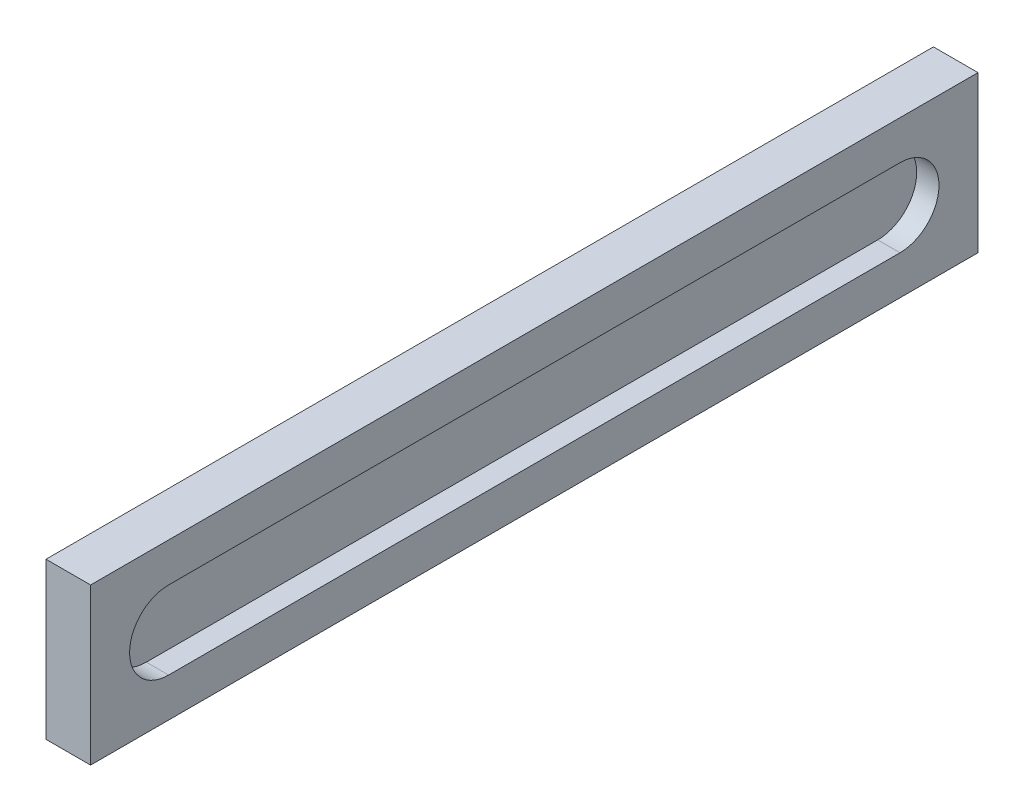
ISO-10303-21;
HEADER;
FILE_DESCRIPTION(('STEP AP214'),'2;1');
FILE_NAME('part.step','',(''),(''),'','','');
FILE_SCHEMA(('AUTOMOTIVE_DESIGN { 1 0 10303 214 1 1 1 1 }'));
ENDSEC;
DATA;
#1=APPLICATION_CONTEXT('core data for automotive mechanical design processes');
#2=APPLICATION_PROTOCOL_DEFINITION('international standard','automotive_design',2000,#1);
#3=PRODUCT_CONTEXT('',#1,'mechanical');
#4=PRODUCT('Part','Part','',(#3));
#5=PRODUCT_RELATED_PRODUCT_CATEGORY('part','',(#4));
#6=PRODUCT_DEFINITION_FORMATION('','',#4);
#7=PRODUCT_DEFINITION_CONTEXT('part definition',#1,'design');
#8=PRODUCT_DEFINITION('design','',#6,#7);
#9=PRODUCT_DEFINITION_SHAPE('','',#8);
#10=(LENGTH_UNIT() NAMED_UNIT(*) SI_UNIT(.MILLI.,.METRE.));
#11=(NAMED_UNIT(*) PLANE_ANGLE_UNIT() SI_UNIT($,.RADIAN.));
#12=(NAMED_UNIT(*) SI_UNIT($,.STERADIAN.) SOLID_ANGLE_UNIT());
#13=UNCERTAINTY_MEASURE_WITH_UNIT(LENGTH_MEASURE(1.E-05),#10,'distance_accuracy_value','');
#14=(GEOMETRIC_REPRESENTATION_CONTEXT(3) GLOBAL_UNCERTAINTY_ASSIGNED_CONTEXT((#13)) GLOBAL_UNIT_ASSIGNED_CONTEXT((#10,
#11,#12)) REPRESENTATION_CONTEXT('',''));
#15=CARTESIAN_POINT('',(0.,0.,0.));
#16=DIRECTION('',(0.,0.,1.));
#17=DIRECTION('',(1.,0.,0.));
#18=AXIS2_PLACEMENT_3D('',#15,#16,#17);
#19=CARTESIAN_POINT('',(20.,0.,0.));
#20=DIRECTION('',(0.,0.,-1.));
#21=DIRECTION('',(-1.,0.,0.));
#22=AXIS2_PLACEMENT_3D('',#19,#20,#21);
#23=PLANE('',#22);
#24=DIRECTION('',(0.,-1.,0.));
#25=VECTOR('',#24,1.);
#26=CARTESIAN_POINT('',(0.,0.,0.));
#27=LINE('',#26,#25);
#28=CARTESIAN_POINT('',(0.,70.,0.));
#29=VERTEX_POINT('',#28);
#30=CARTESIAN_POINT('',(0.,0.,0.));
#31=VERTEX_POINT('',#30);
#32=EDGE_CURVE('E142',#29,#31,#27,.T.);
#33=ORIENTED_EDGE('',*,*,#32,.T.);
#34=DIRECTION('',(-1.,0.,0.));
#35=VECTOR('',#34,1.);
#36=CARTESIAN_POINT('',(20.,0.,0.));
#37=LINE('',#36,#35);
#38=CARTESIAN_POINT('',(20.,0.,0.));
#39=VERTEX_POINT('',#38);
#40=EDGE_CURVE('E11',#39,#31,#37,.T.);
#41=ORIENTED_EDGE('',*,*,#40,.F.);
#42=DIRECTION('',(0.,-1.,0.));
#43=VECTOR('',#42,1.);
#44=CARTESIAN_POINT('',(20.,0.,0.));
#45=LINE('',#44,#43);
#46=CARTESIAN_POINT('',(20.,70.,0.));
#47=VERTEX_POINT('',#46);
#48=EDGE_CURVE('E146',#47,#39,#45,.T.);
#49=ORIENTED_EDGE('',*,*,#48,.F.);
#50=DIRECTION('',(-1.,0.,0.));
#51=VECTOR('',#50,1.);
#52=CARTESIAN_POINT('',(20.,70.,0.));
#53=LINE('',#52,#51);
#54=EDGE_CURVE('E152',#47,#29,#53,.T.);
#55=ORIENTED_EDGE('',*,*,#54,.T.);
#56=EDGE_LOOP('',(#33,#41,#49,#55));
#57=FACE_BOUND('',#56,.T.);
#58=ADVANCED_FACE('F34',(#57),#23,.F.);
#59=CARTESIAN_POINT('',(20.,0.,0.));
#60=DIRECTION('',(0.,1.,0.));
#61=DIRECTION('',(0.,0.,1.));
#62=AXIS2_PLACEMENT_3D('',#59,#60,#61);
#63=PLANE('',#62);
#64=DIRECTION('',(0.,0.,-1.));
#65=VECTOR('',#64,1.);
#66=CARTESIAN_POINT('',(0.,0.,0.));
#67=LINE('',#66,#65);
#68=CARTESIAN_POINT('',(0.,0.,-398.100558659218));
#69=VERTEX_POINT('',#68);
#70=EDGE_CURVE('E155',#31,#69,#67,.T.);
#71=ORIENTED_EDGE('',*,*,#70,.T.);
#72=DIRECTION('',(-1.,0.,0.));
#73=VECTOR('',#72,1.);
#74=CARTESIAN_POINT('',(20.,0.,-398.100558659218));
#75=LINE('',#74,#73);
#76=CARTESIAN_POINT('',(20.,0.,-398.100558659218));
#77=VERTEX_POINT('',#76);
#78=EDGE_CURVE('E41',#77,#69,#75,.T.);
#79=ORIENTED_EDGE('',*,*,#78,.F.);
#80=DIRECTION('',(0.,0.,-1.));
#81=VECTOR('',#80,1.);
#82=CARTESIAN_POINT('',(20.,0.,0.));
#83=LINE('',#82,#81);
#84=EDGE_CURVE('E85',#39,#77,#83,.T.);
#85=ORIENTED_EDGE('',*,*,#84,.F.);
#86=ORIENTED_EDGE('',*,*,#40,.T.);
#87=EDGE_LOOP('',(#71,#79,#85,#86));
#88=FACE_BOUND('',#87,.T.);
#89=ADVANCED_FACE('F184',(#88),#63,.F.);
#90=CARTESIAN_POINT('',(20.,0.,-398.100558659218));
#91=DIRECTION('',(0.,0.,1.));
#92=DIRECTION('',(1.,0.,0.));
#93=AXIS2_PLACEMENT_3D('',#90,#91,#92);
#94=PLANE('',#93);
#95=DIRECTION('',(0.,1.,0.));
#96=VECTOR('',#95,1.);
#97=CARTESIAN_POINT('',(0.,0.,-398.100558659218));
#98=LINE('',#97,#96);
#99=CARTESIAN_POINT('',(0.,70.,-398.100558659218));
#100=VERTEX_POINT('',#99);
#101=EDGE_CURVE('E157',#69,#100,#98,.T.);
#102=ORIENTED_EDGE('',*,*,#101,.T.);
#103=DIRECTION('',(-1.,0.,0.));
#104=VECTOR('',#103,1.);
#105=CARTESIAN_POINT('',(20.,70.,-398.100558659218));
#106=LINE('',#105,#104);
#107=CARTESIAN_POINT('',(20.,70.,-398.100558659218));
#108=VERTEX_POINT('',#107);
#109=EDGE_CURVE('E161',#108,#100,#106,.T.);
#110=ORIENTED_EDGE('',*,*,#109,.F.);
#111=DIRECTION('',(0.,1.,0.));
#112=VECTOR('',#111,1.);
#113=CARTESIAN_POINT('',(20.,0.,-398.100558659218));
#114=LINE('',#113,#112);
#115=EDGE_CURVE('E149',#77,#108,#114,.T.);
#116=ORIENTED_EDGE('',*,*,#115,.F.);
#117=ORIENTED_EDGE('',*,*,#78,.T.);
#118=EDGE_LOOP('',(#102,#110,#116,#117));
#119=FACE_BOUND('',#118,.T.);
#120=ADVANCED_FACE('F166',(#119),#94,.F.);
#121=CARTESIAN_POINT('',(20.,70.,0.));
#122=DIRECTION('',(0.,-1.,0.));
#123=DIRECTION('',(0.,0.,-1.));
#124=AXIS2_PLACEMENT_3D('',#121,#122,#123);
#125=PLANE('',#124);
#126=DIRECTION('',(0.,0.,1.));
#127=VECTOR('',#126,1.);
#128=CARTESIAN_POINT('',(0.,70.,0.));
#129=LINE('',#128,#127);
#130=EDGE_CURVE('E78',#100,#29,#129,.T.);
#131=ORIENTED_EDGE('',*,*,#130,.T.);
#132=ORIENTED_EDGE('',*,*,#54,.F.);
#133=DIRECTION('',(0.,0.,1.));
#134=VECTOR('',#133,1.);
#135=CARTESIAN_POINT('',(20.,70.,0.));
#136=LINE('',#135,#134);
#137=EDGE_CURVE('E57',#108,#47,#136,.T.);
#138=ORIENTED_EDGE('',*,*,#137,.F.);
#139=ORIENTED_EDGE('',*,*,#109,.T.);
#140=EDGE_LOOP('',(#131,#132,#138,#139));
#141=FACE_BOUND('',#140,.T.);
#142=ADVANCED_FACE('F174',(#141),#125,.F.);
#143=CARTESIAN_POINT('',(20.,0.,0.));
#144=DIRECTION('',(-1.,0.,0.));
#145=DIRECTION('',(0.,0.,1.));
#146=AXIS2_PLACEMENT_3D('',#143,#144,#145);
#147=PLANE('',#146);
#148=DIRECTION('',(0.,0.,-1.));
#149=VECTOR('',#148,1.);
#150=CARTESIAN_POINT('',(20.,17.5,-35.));
#151=LINE('',#150,#149);
#152=CARTESIAN_POINT('',(20.,17.5,-35.));
#153=VERTEX_POINT('',#152);
#154=CARTESIAN_POINT('',(20.,17.5,-363.100558659218));
#155=VERTEX_POINT('',#154);
#156=EDGE_CURVE('E136',#153,#155,#151,.T.);
#157=ORIENTED_EDGE('',*,*,#156,.F.);
#158=CARTESIAN_POINT('',(20.,35.,-35.));
#159=DIRECTION('',(1.,0.,0.));
#160=DIRECTION('',(0.,0.,-1.));
#161=AXIS2_PLACEMENT_3D('',#158,#159,#160);
#162=CIRCLE('',#161,17.5);
#163=CARTESIAN_POINT('',(20.,52.5,-35.));
#164=VERTEX_POINT('',#163);
#165=EDGE_CURVE('E48',#164,#153,#162,.T.);
#166=ORIENTED_EDGE('',*,*,#165,.F.);
#167=DIRECTION('',(0.,0.,1.));
#168=VECTOR('',#167,1.);
#169=CARTESIAN_POINT('',(20.,52.5,-35.));
#170=LINE('',#169,#168);
#171=CARTESIAN_POINT('',(20.,52.5,-363.100558659218));
#172=VERTEX_POINT('',#171);
#173=EDGE_CURVE('E127',#172,#164,#170,.T.);
#174=ORIENTED_EDGE('',*,*,#173,.F.);
#175=CARTESIAN_POINT('',(20.,35.,-363.100558659218));
#176=DIRECTION('',(1.,0.,0.));
#177=DIRECTION('',(0.,0.,1.));
#178=AXIS2_PLACEMENT_3D('',#175,#176,#177);
#179=CIRCLE('',#178,17.5);
#180=EDGE_CURVE('E130',#155,#172,#179,.T.);
#181=ORIENTED_EDGE('',*,*,#180,.F.);
#182=EDGE_LOOP('',(#157,#166,#174,#181));
#183=FACE_BOUND('',#182,.T.);
#184=ORIENTED_EDGE('',*,*,#48,.T.);
#185=ORIENTED_EDGE('',*,*,#84,.T.);
#186=ORIENTED_EDGE('',*,*,#115,.T.);
#187=ORIENTED_EDGE('',*,*,#137,.T.);
#188=EDGE_LOOP('',(#184,#185,#186,#187));
#189=FACE_BOUND('',#188,.T.);
#190=ADVANCED_FACE('F176',(#183,#189),#147,.F.);
#191=CARTESIAN_POINT('',(0.,0.,0.));
#192=DIRECTION('',(-1.,0.,0.));
#193=DIRECTION('',(0.,0.,1.));
#194=AXIS2_PLACEMENT_3D('',#191,#192,#193);
#195=PLANE('',#194);
#196=ORIENTED_EDGE('',*,*,#32,.F.);
#197=ORIENTED_EDGE('',*,*,#130,.F.);
#198=ORIENTED_EDGE('',*,*,#101,.F.);
#199=ORIENTED_EDGE('',*,*,#70,.F.);
#200=EDGE_LOOP('',(#196,#197,#198,#199));
#201=FACE_BOUND('',#200,.T.);
#202=ADVANCED_FACE('F170',(#201),#195,.T.);
#203=CARTESIAN_POINT('',(10.,35.,-35.));
#204=DIRECTION('',(1.,0.,0.));
#205=DIRECTION('',(0.,0.,-1.));
#206=AXIS2_PLACEMENT_3D('',#203,#204,#205);
#207=CYLINDRICAL_SURFACE('',#206,17.5);
#208=ORIENTED_EDGE('',*,*,#165,.T.);
#209=DIRECTION('',(1.,0.,0.));
#210=VECTOR('',#209,1.);
#211=CARTESIAN_POINT('',(10.,17.5,-35.));
#212=LINE('',#211,#210);
#213=CARTESIAN_POINT('',(10.,17.5,-35.));
#214=VERTEX_POINT('',#213);
#215=EDGE_CURVE('E105',#214,#153,#212,.T.);
#216=ORIENTED_EDGE('',*,*,#215,.F.);
#217=CARTESIAN_POINT('',(10.,35.,-35.));
#218=DIRECTION('',(1.,0.,0.));
#219=DIRECTION('',(0.,0.,-1.));
#220=AXIS2_PLACEMENT_3D('',#217,#218,#219);
#221=CIRCLE('',#220,17.5);
#222=CARTESIAN_POINT('',(10.,52.5,-35.));
#223=VERTEX_POINT('',#222);
#224=EDGE_CURVE('E109',#223,#214,#221,.T.);
#225=ORIENTED_EDGE('',*,*,#224,.F.);
#226=DIRECTION('',(1.,0.,0.));
#227=VECTOR('',#226,1.);
#228=CARTESIAN_POINT('',(10.,52.5,-35.));
#229=LINE('',#228,#227);
#230=EDGE_CURVE('E140',#223,#164,#229,.T.);
#231=ORIENTED_EDGE('',*,*,#230,.T.);
#232=EDGE_LOOP('',(#208,#216,#225,#231));
#233=FACE_BOUND('',#232,.T.);
#234=ADVANCED_FACE('F107',(#233),#207,.F.);
#235=CARTESIAN_POINT('',(10.,52.5,-35.));
#236=DIRECTION('',(0.,1.,0.));
#237=DIRECTION('',(0.,0.,1.));
#238=AXIS2_PLACEMENT_3D('',#235,#236,#237);
#239=PLANE('',#238);
#240=ORIENTED_EDGE('',*,*,#173,.T.);
#241=ORIENTED_EDGE('',*,*,#230,.F.);
#242=DIRECTION('',(0.,0.,1.));
#243=VECTOR('',#242,1.);
#244=CARTESIAN_POINT('',(10.,52.5,-35.));
#245=LINE('',#244,#243);
#246=CARTESIAN_POINT('',(10.,52.5,-363.100558659218));
#247=VERTEX_POINT('',#246);
#248=EDGE_CURVE('E115',#247,#223,#245,.T.);
#249=ORIENTED_EDGE('',*,*,#248,.F.);
#250=DIRECTION('',(1.,0.,0.));
#251=VECTOR('',#250,1.);
#252=CARTESIAN_POINT('',(10.,52.5,-363.100558659218));
#253=LINE('',#252,#251);
#254=EDGE_CURVE('E143',#247,#172,#253,.T.);
#255=ORIENTED_EDGE('',*,*,#254,.T.);
#256=EDGE_LOOP('',(#240,#241,#249,#255));
#257=FACE_BOUND('',#256,.T.);
#258=ADVANCED_FACE('F223',(#257),#239,.F.);
#259=CARTESIAN_POINT('',(10.,35.,-363.100558659218));
#260=DIRECTION('',(1.,0.,0.));
#261=DIRECTION('',(0.,0.,-1.));
#262=AXIS2_PLACEMENT_3D('',#259,#260,#261);
#263=CYLINDRICAL_SURFACE('',#262,17.5);
#264=ORIENTED_EDGE('',*,*,#180,.T.);
#265=ORIENTED_EDGE('',*,*,#254,.F.);
#266=CARTESIAN_POINT('',(10.,35.,-363.100558659218));
#267=DIRECTION('',(1.,0.,0.));
#268=DIRECTION('',(0.,0.,1.));
#269=AXIS2_PLACEMENT_3D('',#266,#267,#268);
#270=CIRCLE('',#269,17.5);
#271=CARTESIAN_POINT('',(10.,17.5,-363.100558659218));
#272=VERTEX_POINT('',#271);
#273=EDGE_CURVE('E123',#272,#247,#270,.T.);
#274=ORIENTED_EDGE('',*,*,#273,.F.);
#275=DIRECTION('',(1.,0.,0.));
#276=VECTOR('',#275,1.);
#277=CARTESIAN_POINT('',(10.,17.5,-363.100558659218));
#278=LINE('',#277,#276);
#279=EDGE_CURVE('E114',#272,#155,#278,.T.);
#280=ORIENTED_EDGE('',*,*,#279,.T.);
#281=EDGE_LOOP('',(#264,#265,#274,#280));
#282=FACE_BOUND('',#281,.T.);
#283=ADVANCED_FACE('F232',(#282),#263,.F.);
#284=CARTESIAN_POINT('',(10.,17.5,-35.));
#285=DIRECTION('',(0.,-1.,0.));
#286=DIRECTION('',(0.,0.,-1.));
#287=AXIS2_PLACEMENT_3D('',#284,#285,#286);
#288=PLANE('',#287);
#289=ORIENTED_EDGE('',*,*,#156,.T.);
#290=ORIENTED_EDGE('',*,*,#279,.F.);
#291=DIRECTION('',(0.,0.,-1.));
#292=VECTOR('',#291,1.);
#293=CARTESIAN_POINT('',(10.,17.5,-35.));
#294=LINE('',#293,#292);
#295=EDGE_CURVE('E118',#214,#272,#294,.T.);
#296=ORIENTED_EDGE('',*,*,#295,.F.);
#297=ORIENTED_EDGE('',*,*,#215,.T.);
#298=EDGE_LOOP('',(#289,#290,#296,#297));
#299=FACE_BOUND('',#298,.T.);
#300=ADVANCED_FACE('F119',(#299),#288,.F.);
#301=CARTESIAN_POINT('',(10.,35.,-35.));
#302=DIRECTION('',(1.,0.,0.));
#303=DIRECTION('',(0.,0.,-1.));
#304=AXIS2_PLACEMENT_3D('',#301,#302,#303);
#305=PLANE('',#304);
#306=ORIENTED_EDGE('',*,*,#224,.T.);
#307=ORIENTED_EDGE('',*,*,#295,.T.);
#308=ORIENTED_EDGE('',*,*,#273,.T.);
#309=ORIENTED_EDGE('',*,*,#248,.T.);
#310=EDGE_LOOP('',(#306,#307,#308,#309));
#311=FACE_BOUND('',#310,.T.);
#312=ADVANCED_FACE('F125',(#311),#305,.T.);
#313=CLOSED_SHELL('',(#58,#89,#120,#142,#190,#202,#234,#258,#283,#300,#312));
#314=MANIFOLD_SOLID_BREP('B2',#313);
#315=ADVANCED_BREP_SHAPE_REPRESENTATION('',(#18,#314),#14);
#316=SHAPE_DEFINITION_REPRESENTATION(#9,#315);
ENDSEC;
END-ISO-10303-21;
